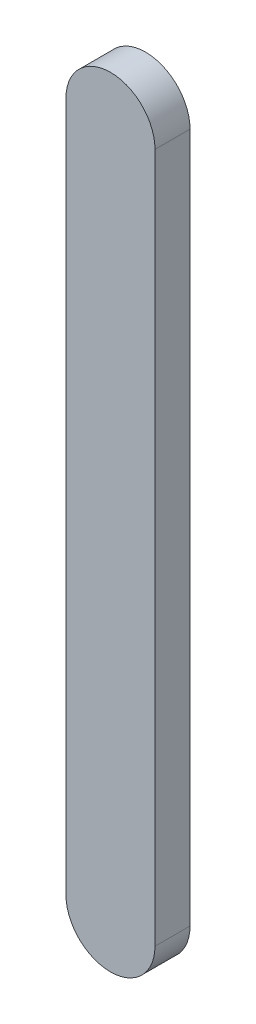
ISO-10303-21;
HEADER;
FILE_DESCRIPTION(('STEP AP214'),'2;1');
FILE_NAME('part.step','',(''),(''),'','','');
FILE_SCHEMA(('AUTOMOTIVE_DESIGN { 1 0 10303 214 1 1 1 1 }'));
ENDSEC;
DATA;
#1=APPLICATION_CONTEXT('core data for automotive mechanical design processes');
#2=APPLICATION_PROTOCOL_DEFINITION('international standard','automotive_design',2000,#1);
#3=PRODUCT_CONTEXT('',#1,'mechanical');
#4=PRODUCT('Part','Part','',(#3));
#5=PRODUCT_RELATED_PRODUCT_CATEGORY('part','',(#4));
#6=PRODUCT_DEFINITION_FORMATION('','',#4);
#7=PRODUCT_DEFINITION_CONTEXT('part definition',#1,'design');
#8=PRODUCT_DEFINITION('design','',#6,#7);
#9=PRODUCT_DEFINITION_SHAPE('','',#8);
#10=(LENGTH_UNIT() NAMED_UNIT(*) SI_UNIT(.MILLI.,.METRE.));
#11=(NAMED_UNIT(*) PLANE_ANGLE_UNIT() SI_UNIT($,.RADIAN.));
#12=(NAMED_UNIT(*) SI_UNIT($,.STERADIAN.) SOLID_ANGLE_UNIT());
#13=UNCERTAINTY_MEASURE_WITH_UNIT(LENGTH_MEASURE(1.E-05),#10,'distance_accuracy_value','');
#14=(GEOMETRIC_REPRESENTATION_CONTEXT(3) GLOBAL_UNCERTAINTY_ASSIGNED_CONTEXT((#13)) GLOBAL_UNIT_ASSIGNED_CONTEXT((#10,
#11,#12)) REPRESENTATION_CONTEXT('',''));
#15=CARTESIAN_POINT('',(0.,0.,0.));
#16=DIRECTION('',(0.,0.,1.));
#17=DIRECTION('',(1.,0.,0.));
#18=AXIS2_PLACEMENT_3D('',#15,#16,#17);
#19=CARTESIAN_POINT('',(140.589,89.916,0.));
#20=DIRECTION('',(-1.,0.,0.));
#21=DIRECTION('',(0.,1.,0.));
#22=AXIS2_PLACEMENT_3D('',#19,#20,#21);
#23=PLANE('',#22);
#24=DIRECTION('',(0.,1.,0.));
#25=VECTOR('',#24,1.);
#26=CARTESIAN_POINT('',(140.589,89.916,0.1999996));
#27=LINE('',#26,#25);
#28=CARTESIAN_POINT('',(140.589,89.916,0.1999996));
#29=VERTEX_POINT('',#28);
#30=CARTESIAN_POINT('',(140.589,93.853,0.1999996));
#31=VERTEX_POINT('',#30);
#32=EDGE_CURVE('E11',#29,#31,#27,.T.);
#33=ORIENTED_EDGE('',*,*,#32,.F.);
#34=DIRECTION('',(0.,0.,1.));
#35=VECTOR('',#34,1.);
#36=CARTESIAN_POINT('',(140.589,89.916,0.));
#37=LINE('',#36,#35);
#38=CARTESIAN_POINT('',(140.589,89.916,0.));
#39=VERTEX_POINT('',#38);
#40=EDGE_CURVE('E24',#39,#29,#37,.T.);
#41=ORIENTED_EDGE('',*,*,#40,.F.);
#42=DIRECTION('',(0.,1.,0.));
#43=VECTOR('',#42,1.);
#44=CARTESIAN_POINT('',(140.589,89.916,0.));
#45=LINE('',#44,#43);
#46=CARTESIAN_POINT('',(140.589,93.853,0.));
#47=VERTEX_POINT('',#46);
#48=EDGE_CURVE('E75',#39,#47,#45,.T.);
#49=ORIENTED_EDGE('',*,*,#48,.T.);
#50=DIRECTION('',(0.,0.,1.));
#51=VECTOR('',#50,1.);
#52=CARTESIAN_POINT('',(140.589,93.853,0.));
#53=LINE('',#52,#51);
#54=EDGE_CURVE('E37',#47,#31,#53,.T.);
#55=ORIENTED_EDGE('',*,*,#54,.T.);
#56=EDGE_LOOP('',(#33,#41,#49,#55));
#57=FACE_BOUND('',#56,.T.);
#58=ADVANCED_FACE('F17',(#57),#23,.F.);
#59=CARTESIAN_POINT('',(140.335,93.853,0.));
#60=DIRECTION('',(0.,0.,-1.));
#61=DIRECTION('',(1.,0.,0.));
#62=AXIS2_PLACEMENT_3D('',#59,#60,#61);
#63=CYLINDRICAL_SURFACE('',#62,0.254000000000005);
#64=CARTESIAN_POINT('',(140.335,93.853,0.1999996));
#65=DIRECTION('',(0.,0.,1.));
#66=DIRECTION('',(1.,0.,0.));
#67=AXIS2_PLACEMENT_3D('',#64,#65,#66);
#68=CIRCLE('',#67,0.254000000000005);
#69=CARTESIAN_POINT('',(140.081,93.853,0.1999996));
#70=VERTEX_POINT('',#69);
#71=EDGE_CURVE('E83',#31,#70,#68,.T.);
#72=ORIENTED_EDGE('',*,*,#71,.F.);
#73=ORIENTED_EDGE('',*,*,#54,.F.);
#74=CARTESIAN_POINT('',(140.335,93.853,0.));
#75=DIRECTION('',(0.,0.,1.));
#76=DIRECTION('',(1.,0.,0.));
#77=AXIS2_PLACEMENT_3D('',#74,#75,#76);
#78=CIRCLE('',#77,0.254000000000005);
#79=CARTESIAN_POINT('',(140.081,93.853,0.));
#80=VERTEX_POINT('',#79);
#81=EDGE_CURVE('E81',#47,#80,#78,.T.);
#82=ORIENTED_EDGE('',*,*,#81,.T.);
#83=DIRECTION('',(0.,0.,1.));
#84=VECTOR('',#83,1.);
#85=CARTESIAN_POINT('',(140.081,93.853,0.));
#86=LINE('',#85,#84);
#87=EDGE_CURVE('E67',#80,#70,#86,.T.);
#88=ORIENTED_EDGE('',*,*,#87,.T.);
#89=EDGE_LOOP('',(#72,#73,#82,#88));
#90=FACE_BOUND('',#89,.T.);
#91=ADVANCED_FACE('F89',(#90),#63,.T.);
#92=CARTESIAN_POINT('',(140.081,93.853,0.));
#93=DIRECTION('',(1.,0.,0.));
#94=DIRECTION('',(0.,-1.,0.));
#95=AXIS2_PLACEMENT_3D('',#92,#93,#94);
#96=PLANE('',#95);
#97=DIRECTION('',(0.,-1.,0.));
#98=VECTOR('',#97,1.);
#99=CARTESIAN_POINT('',(140.081,93.853,0.1999996));
#100=LINE('',#99,#98);
#101=CARTESIAN_POINT('',(140.081,89.916,0.1999996));
#102=VERTEX_POINT('',#101);
#103=EDGE_CURVE('E71',#70,#102,#100,.T.);
#104=ORIENTED_EDGE('',*,*,#103,.F.);
#105=ORIENTED_EDGE('',*,*,#87,.F.);
#106=DIRECTION('',(0.,-1.,0.));
#107=VECTOR('',#106,1.);
#108=CARTESIAN_POINT('',(140.081,93.853,0.));
#109=LINE('',#108,#107);
#110=CARTESIAN_POINT('',(140.081,89.916,0.));
#111=VERTEX_POINT('',#110);
#112=EDGE_CURVE('E63',#80,#111,#109,.T.);
#113=ORIENTED_EDGE('',*,*,#112,.T.);
#114=DIRECTION('',(0.,0.,1.));
#115=VECTOR('',#114,1.);
#116=CARTESIAN_POINT('',(140.081,89.916,0.));
#117=LINE('',#116,#115);
#118=EDGE_CURVE('E53',#111,#102,#117,.T.);
#119=ORIENTED_EDGE('',*,*,#118,.T.);
#120=EDGE_LOOP('',(#104,#105,#113,#119));
#121=FACE_BOUND('',#120,.T.);
#122=ADVANCED_FACE('F66',(#121),#96,.F.);
#123=CARTESIAN_POINT('',(140.335,89.916,0.));
#124=DIRECTION('',(0.,0.,-1.));
#125=DIRECTION('',(-1.,0.,0.));
#126=AXIS2_PLACEMENT_3D('',#123,#124,#125);
#127=CYLINDRICAL_SURFACE('',#126,0.254);
#128=CARTESIAN_POINT('',(140.335,89.916,0.1999996));
#129=DIRECTION('',(0.,0.,1.));
#130=DIRECTION('',(-1.,0.,0.));
#131=AXIS2_PLACEMENT_3D('',#128,#129,#130);
#132=CIRCLE('',#131,0.254);
#133=EDGE_CURVE('E59',#102,#29,#132,.T.);
#134=ORIENTED_EDGE('',*,*,#133,.F.);
#135=ORIENTED_EDGE('',*,*,#118,.F.);
#136=CARTESIAN_POINT('',(140.335,89.916,0.));
#137=DIRECTION('',(0.,0.,1.));
#138=DIRECTION('',(-1.,0.,0.));
#139=AXIS2_PLACEMENT_3D('',#136,#137,#138);
#140=CIRCLE('',#139,0.254);
#141=EDGE_CURVE('E57',#111,#39,#140,.T.);
#142=ORIENTED_EDGE('',*,*,#141,.T.);
#143=ORIENTED_EDGE('',*,*,#40,.T.);
#144=EDGE_LOOP('',(#134,#135,#142,#143));
#145=FACE_BOUND('',#144,.T.);
#146=ADVANCED_FACE('F55',(#145),#127,.T.);
#147=CARTESIAN_POINT('',(140.589,89.916,0.));
#148=DIRECTION('',(0.,0.,-1.));
#149=DIRECTION('',(-1.,0.,0.));
#150=AXIS2_PLACEMENT_3D('',#147,#148,#149);
#151=PLANE('',#150);
#152=ORIENTED_EDGE('',*,*,#141,.F.);
#153=ORIENTED_EDGE('',*,*,#112,.F.);
#154=ORIENTED_EDGE('',*,*,#81,.F.);
#155=ORIENTED_EDGE('',*,*,#48,.F.);
#156=EDGE_LOOP('',(#152,#153,#154,#155));
#157=FACE_BOUND('',#156,.T.);
#158=ADVANCED_FACE('F74',(#157),#151,.T.);
#159=CARTESIAN_POINT('',(140.589,89.916,0.1999996));
#160=DIRECTION('',(0.,0.,-1.));
#161=DIRECTION('',(-1.,0.,0.));
#162=AXIS2_PLACEMENT_3D('',#159,#160,#161);
#163=PLANE('',#162);
#164=ORIENTED_EDGE('',*,*,#32,.T.);
#165=ORIENTED_EDGE('',*,*,#71,.T.);
#166=ORIENTED_EDGE('',*,*,#103,.T.);
#167=ORIENTED_EDGE('',*,*,#133,.T.);
#168=EDGE_LOOP('',(#164,#165,#166,#167));
#169=FACE_BOUND('',#168,.T.);
#170=ADVANCED_FACE('F91',(#169),#163,.F.);
#171=CLOSED_SHELL('',(#58,#91,#122,#146,#158,#170));
#172=MANIFOLD_SOLID_BREP('B1',#171);
#173=ADVANCED_BREP_SHAPE_REPRESENTATION('',(#18,#172),#14);
#174=SHAPE_DEFINITION_REPRESENTATION(#9,#173);
ENDSEC;
END-ISO-10303-21;
